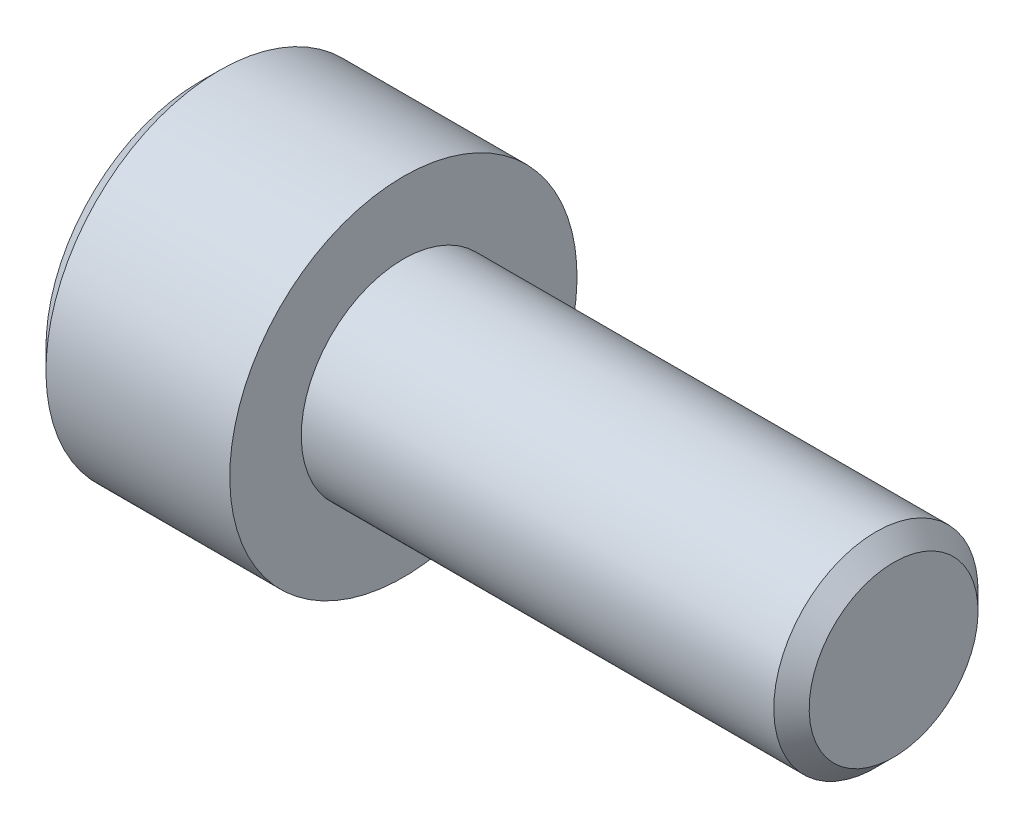
ISO-10303-21;
HEADER;
FILE_DESCRIPTION(('STEP AP214'),'2;1');
FILE_NAME('part.step','',(''),(''),'','','');
FILE_SCHEMA(('AUTOMOTIVE_DESIGN { 1 0 10303 214 1 1 1 1 }'));
ENDSEC;
DATA;
#1=APPLICATION_CONTEXT('core data for automotive mechanical design processes');
#2=APPLICATION_PROTOCOL_DEFINITION('international standard','automotive_design',2000,#1);
#3=PRODUCT_CONTEXT('',#1,'mechanical');
#4=PRODUCT('Part','Part','',(#3));
#5=PRODUCT_RELATED_PRODUCT_CATEGORY('part','',(#4));
#6=PRODUCT_DEFINITION_FORMATION('','',#4);
#7=PRODUCT_DEFINITION_CONTEXT('part definition',#1,'design');
#8=PRODUCT_DEFINITION('design','',#6,#7);
#9=PRODUCT_DEFINITION_SHAPE('','',#8);
#10=(LENGTH_UNIT() NAMED_UNIT(*) SI_UNIT(.MILLI.,.METRE.));
#11=(NAMED_UNIT(*) PLANE_ANGLE_UNIT() SI_UNIT($,.RADIAN.));
#12=(NAMED_UNIT(*) SI_UNIT($,.STERADIAN.) SOLID_ANGLE_UNIT());
#13=UNCERTAINTY_MEASURE_WITH_UNIT(LENGTH_MEASURE(1.E-05),#10,'distance_accuracy_value','');
#14=(GEOMETRIC_REPRESENTATION_CONTEXT(3) GLOBAL_UNCERTAINTY_ASSIGNED_CONTEXT((#13)) GLOBAL_UNIT_ASSIGNED_CONTEXT((#10,
#11,#12)) REPRESENTATION_CONTEXT('',''));
#15=CARTESIAN_POINT('',(0.,0.,0.));
#16=DIRECTION('',(0.,0.,1.));
#17=DIRECTION('',(1.,0.,0.));
#18=AXIS2_PLACEMENT_3D('',#15,#16,#17);
#19=CARTESIAN_POINT('',(12.,0.,0.));
#20=DIRECTION('',(1.,0.,0.));
#21=DIRECTION('',(0.,1.,0.));
#22=AXIS2_PLACEMENT_3D('',#19,#20,#21);
#23=CYLINDRICAL_SURFACE('',#22,2.5);
#24=CARTESIAN_POINT('',(0.,0.,0.));
#25=DIRECTION('',(1.,0.,0.));
#26=DIRECTION('',(0.,1.,0.));
#27=AXIS2_PLACEMENT_3D('',#24,#25,#26);
#28=CIRCLE('',#27,2.5);
#29=CARTESIAN_POINT('',(0.,2.5,0.));
#30=VERTEX_POINT('',#29);
#31=EDGE_CURVE('E142',#30,#30,#28,.T.);
#32=ORIENTED_EDGE('',*,*,#31,.T.);
#33=EDGE_LOOP('',(#32));
#34=FACE_BOUND('',#33,.T.);
#35=CARTESIAN_POINT('',(11.567,0.,0.));
#36=DIRECTION('',(1.,0.,0.));
#37=DIRECTION('',(0.,1.,0.));
#38=AXIS2_PLACEMENT_3D('',#35,#36,#37);
#39=CIRCLE('',#38,2.5);
#40=CARTESIAN_POINT('',(11.567,2.5,0.));
#41=VERTEX_POINT('',#40);
#42=EDGE_CURVE('E11',#41,#41,#39,.T.);
#43=ORIENTED_EDGE('',*,*,#42,.F.);
#44=EDGE_LOOP('',(#43));
#45=FACE_BOUND('',#44,.T.);
#46=ADVANCED_FACE('F37',(#34,#45),#23,.T.);
#47=CARTESIAN_POINT('',(12.,0.,0.));
#48=DIRECTION('',(-1.,0.,0.));
#49=DIRECTION('',(0.,-1.,0.));
#50=AXIS2_PLACEMENT_3D('',#47,#48,#49);
#51=CONICAL_SURFACE('',#50,2.067,0.785398163397449);
#52=ORIENTED_EDGE('',*,*,#42,.T.);
#53=EDGE_LOOP('',(#52));
#54=FACE_BOUND('',#53,.T.);
#55=CARTESIAN_POINT('',(12.,0.,0.));
#56=DIRECTION('',(1.,0.,0.));
#57=DIRECTION('',(0.,1.,0.));
#58=AXIS2_PLACEMENT_3D('',#55,#56,#57);
#59=CIRCLE('',#58,2.067);
#60=CARTESIAN_POINT('',(12.,2.067,0.));
#61=VERTEX_POINT('',#60);
#62=EDGE_CURVE('E50',#61,#61,#59,.T.);
#63=ORIENTED_EDGE('',*,*,#62,.F.);
#64=EDGE_LOOP('',(#63));
#65=FACE_BOUND('',#64,.T.);
#66=ADVANCED_FACE('F162',(#54,#65),#51,.T.);
#67=CARTESIAN_POINT('',(12.,2.067,0.));
#68=DIRECTION('',(1.,0.,0.));
#69=DIRECTION('',(0.,1.,0.));
#70=AXIS2_PLACEMENT_3D('',#67,#68,#69);
#71=PLANE('',#70);
#72=ORIENTED_EDGE('',*,*,#62,.T.);
#73=EDGE_LOOP('',(#72));
#74=FACE_BOUND('',#73,.T.);
#75=ADVANCED_FACE('F159',(#74),#71,.T.);
#76=CARTESIAN_POINT('',(-5.,0.,0.));
#77=DIRECTION('',(-1.,0.,0.));
#78=DIRECTION('',(0.,-1.,0.));
#79=AXIS2_PLACEMENT_3D('',#76,#77,#78);
#80=PLANE('',#79);
#81=DIRECTION('',(0.,0.5,-0.866025403784438));
#82=VECTOR('',#81,1.);
#83=CARTESIAN_POINT('',(-5.,1.15470053837925,2.));
#84=LINE('',#83,#82);
#85=CARTESIAN_POINT('',(-5.,1.15470053837925,2.));
#86=VERTEX_POINT('',#85);
#87=CARTESIAN_POINT('',(-5.,2.3094010767585,0.));
#88=VERTEX_POINT('',#87);
#89=EDGE_CURVE('E53',#86,#88,#84,.T.);
#90=ORIENTED_EDGE('',*,*,#89,.F.);
#91=DIRECTION('',(0.,1.,0.));
#92=VECTOR('',#91,1.);
#93=CARTESIAN_POINT('',(-5.,-1.15470053837925,2.));
#94=LINE('',#93,#92);
#95=CARTESIAN_POINT('',(-5.,-1.15470053837925,2.));
#96=VERTEX_POINT('',#95);
#97=EDGE_CURVE('E140',#96,#86,#94,.T.);
#98=ORIENTED_EDGE('',*,*,#97,.F.);
#99=DIRECTION('',(0.,0.5,0.866025403784439));
#100=VECTOR('',#99,1.);
#101=CARTESIAN_POINT('',(-5.,-2.3094010767585,0.));
#102=LINE('',#101,#100);
#103=CARTESIAN_POINT('',(-5.,-2.3094010767585,0.));
#104=VERTEX_POINT('',#103);
#105=EDGE_CURVE('E134',#104,#96,#102,.T.);
#106=ORIENTED_EDGE('',*,*,#105,.F.);
#107=DIRECTION('',(0.,-0.5,0.866025403784439));
#108=VECTOR('',#107,1.);
#109=CARTESIAN_POINT('',(-5.,-1.15470053837925,-2.));
#110=LINE('',#109,#108);
#111=CARTESIAN_POINT('',(-5.,-1.15470053837925,-2.));
#112=VERTEX_POINT('',#111);
#113=EDGE_CURVE('E105',#112,#104,#110,.T.);
#114=ORIENTED_EDGE('',*,*,#113,.F.);
#115=DIRECTION('',(0.,-1.,0.));
#116=VECTOR('',#115,1.);
#117=CARTESIAN_POINT('',(-5.,1.15470053837925,-2.));
#118=LINE('',#117,#116);
#119=CARTESIAN_POINT('',(-5.,1.15470053837925,-2.));
#120=VERTEX_POINT('',#119);
#121=EDGE_CURVE('E133',#120,#112,#118,.T.);
#122=ORIENTED_EDGE('',*,*,#121,.F.);
#123=DIRECTION('',(0.,-0.5,-0.866025403784439));
#124=VECTOR('',#123,1.);
#125=CARTESIAN_POINT('',(-5.,2.3094010767585,0.));
#126=LINE('',#125,#124);
#127=EDGE_CURVE('E129',#88,#120,#126,.T.);
#128=ORIENTED_EDGE('',*,*,#127,.F.);
#129=EDGE_LOOP('',(#90,#98,#106,#114,#122,#128));
#130=FACE_BOUND('',#129,.T.);
#131=CARTESIAN_POINT('',(-5.,0.,0.));
#132=DIRECTION('',(1.,0.,0.));
#133=DIRECTION('',(0.,1.,0.));
#134=AXIS2_PLACEMENT_3D('',#131,#132,#133);
#135=CIRCLE('',#134,3.75);
#136=CARTESIAN_POINT('',(-5.,3.75,0.));
#137=VERTEX_POINT('',#136);
#138=EDGE_CURVE('E154',#137,#137,#135,.T.);
#139=ORIENTED_EDGE('',*,*,#138,.F.);
#140=EDGE_LOOP('',(#139));
#141=FACE_BOUND('',#140,.T.);
#142=ADVANCED_FACE('F169',(#130,#141),#80,.T.);
#143=CARTESIAN_POINT('',(-4.5,0.,0.));
#144=DIRECTION('',(1.,0.,0.));
#145=DIRECTION('',(0.,1.,0.));
#146=AXIS2_PLACEMENT_3D('',#143,#144,#145);
#147=CONICAL_SURFACE('',#146,4.25,0.785398163397448);
#148=ORIENTED_EDGE('',*,*,#138,.T.);
#149=EDGE_LOOP('',(#148));
#150=FACE_BOUND('',#149,.T.);
#151=CARTESIAN_POINT('',(-4.5,0.,0.));
#152=DIRECTION('',(1.,0.,0.));
#153=DIRECTION('',(0.,1.,0.));
#154=AXIS2_PLACEMENT_3D('',#151,#152,#153);
#155=CIRCLE('',#154,4.25);
#156=CARTESIAN_POINT('',(-4.5,4.25,0.));
#157=VERTEX_POINT('',#156);
#158=EDGE_CURVE('E155',#157,#157,#155,.T.);
#159=ORIENTED_EDGE('',*,*,#158,.F.);
#160=EDGE_LOOP('',(#159));
#161=FACE_BOUND('',#160,.T.);
#162=ADVANCED_FACE('F176',(#150,#161),#147,.T.);
#163=CARTESIAN_POINT('',(12.,0.,0.));
#164=DIRECTION('',(1.,0.,0.));
#165=DIRECTION('',(0.,1.,0.));
#166=AXIS2_PLACEMENT_3D('',#163,#164,#165);
#167=CYLINDRICAL_SURFACE('',#166,4.25);
#168=ORIENTED_EDGE('',*,*,#158,.T.);
#169=EDGE_LOOP('',(#168));
#170=FACE_BOUND('',#169,.T.);
#171=CARTESIAN_POINT('',(0.,0.,0.));
#172=DIRECTION('',(1.,0.,0.));
#173=DIRECTION('',(0.,1.,0.));
#174=AXIS2_PLACEMENT_3D('',#171,#172,#173);
#175=CIRCLE('',#174,4.25);
#176=CARTESIAN_POINT('',(0.,4.25,0.));
#177=VERTEX_POINT('',#176);
#178=EDGE_CURVE('E146',#177,#177,#175,.T.);
#179=ORIENTED_EDGE('',*,*,#178,.F.);
#180=EDGE_LOOP('',(#179));
#181=FACE_BOUND('',#180,.T.);
#182=ADVANCED_FACE('F179',(#170,#181),#167,.T.);
#183=CARTESIAN_POINT('',(0.,2.5,0.));
#184=DIRECTION('',(1.,0.,0.));
#185=DIRECTION('',(0.,1.,0.));
#186=AXIS2_PLACEMENT_3D('',#183,#184,#185);
#187=PLANE('',#186);
#188=ORIENTED_EDGE('',*,*,#178,.T.);
#189=EDGE_LOOP('',(#188));
#190=FACE_BOUND('',#189,.T.);
#191=ORIENTED_EDGE('',*,*,#31,.F.);
#192=EDGE_LOOP('',(#191));
#193=FACE_BOUND('',#192,.T.);
#194=ADVANCED_FACE('F183',(#190,#193),#187,.T.);
#195=CARTESIAN_POINT('',(-2.5,1.15470053837925,2.));
#196=DIRECTION('',(0.,0.866025403784439,0.5));
#197=DIRECTION('',(0.,-0.5,0.866025403784439));
#198=AXIS2_PLACEMENT_3D('',#195,#196,#197);
#199=PLANE('',#198);
#200=ORIENTED_EDGE('',*,*,#89,.T.);
#201=DIRECTION('',(-1.,0.,0.));
#202=VECTOR('',#201,1.);
#203=CARTESIAN_POINT('',(-2.5,2.3094010767585,0.));
#204=LINE('',#203,#202);
#205=CARTESIAN_POINT('',(-2.5,2.3094010767585,0.));
#206=VERTEX_POINT('',#205);
#207=EDGE_CURVE('E81',#206,#88,#204,.T.);
#208=ORIENTED_EDGE('',*,*,#207,.F.);
#209=DIRECTION('',(0.,0.5,-0.866025403784438));
#210=VECTOR('',#209,1.);
#211=CARTESIAN_POINT('',(-2.5,1.15470053837925,2.));
#212=LINE('',#211,#210);
#213=CARTESIAN_POINT('',(-2.5,1.15470053837925,2.));
#214=VERTEX_POINT('',#213);
#215=EDGE_CURVE('E136',#214,#206,#212,.T.);
#216=ORIENTED_EDGE('',*,*,#215,.F.);
#217=DIRECTION('',(-1.,0.,0.));
#218=VECTOR('',#217,1.);
#219=CARTESIAN_POINT('',(-2.5,1.15470053837925,2.));
#220=LINE('',#219,#218);
#221=EDGE_CURVE('E65',#214,#86,#220,.T.);
#222=ORIENTED_EDGE('',*,*,#221,.T.);
#223=EDGE_LOOP('',(#200,#208,#216,#222));
#224=FACE_BOUND('',#223,.T.);
#225=ADVANCED_FACE('F189',(#224),#199,.F.);
#226=CARTESIAN_POINT('',(-2.5,-1.15470053837925,2.));
#227=DIRECTION('',(0.,0.,1.));
#228=DIRECTION('',(0.,-1.,0.));
#229=AXIS2_PLACEMENT_3D('',#226,#227,#228);
#230=PLANE('',#229);
#231=ORIENTED_EDGE('',*,*,#97,.T.);
#232=ORIENTED_EDGE('',*,*,#221,.F.);
#233=DIRECTION('',(0.,1.,0.));
#234=VECTOR('',#233,1.);
#235=CARTESIAN_POINT('',(-2.5,-1.15470053837925,2.));
#236=LINE('',#235,#234);
#237=CARTESIAN_POINT('',(-2.5,-1.15470053837925,2.));
#238=VERTEX_POINT('',#237);
#239=EDGE_CURVE('E112',#238,#214,#236,.T.);
#240=ORIENTED_EDGE('',*,*,#239,.F.);
#241=DIRECTION('',(-1.,0.,0.));
#242=VECTOR('',#241,1.);
#243=CARTESIAN_POINT('',(-2.5,-1.15470053837925,2.));
#244=LINE('',#243,#242);
#245=EDGE_CURVE('E106',#238,#96,#244,.T.);
#246=ORIENTED_EDGE('',*,*,#245,.T.);
#247=EDGE_LOOP('',(#231,#232,#240,#246));
#248=FACE_BOUND('',#247,.T.);
#249=ADVANCED_FACE('F195',(#248),#230,.F.);
#250=CARTESIAN_POINT('',(-2.5,-2.3094010767585,0.));
#251=DIRECTION('',(0.,-0.866025403784439,0.5));
#252=DIRECTION('',(0.,-0.5,-0.866025403784439));
#253=AXIS2_PLACEMENT_3D('',#250,#251,#252);
#254=PLANE('',#253);
#255=ORIENTED_EDGE('',*,*,#105,.T.);
#256=ORIENTED_EDGE('',*,*,#245,.F.);
#257=DIRECTION('',(0.,0.5,0.866025403784439));
#258=VECTOR('',#257,1.);
#259=CARTESIAN_POINT('',(-2.5,-2.3094010767585,0.));
#260=LINE('',#259,#258);
#261=CARTESIAN_POINT('',(-2.5,-2.3094010767585,0.));
#262=VERTEX_POINT('',#261);
#263=EDGE_CURVE('E109',#262,#238,#260,.T.);
#264=ORIENTED_EDGE('',*,*,#263,.F.);
#265=DIRECTION('',(-1.,0.,0.));
#266=VECTOR('',#265,1.);
#267=CARTESIAN_POINT('',(-2.5,-2.3094010767585,0.));
#268=LINE('',#267,#266);
#269=EDGE_CURVE('E94',#262,#104,#268,.T.);
#270=ORIENTED_EDGE('',*,*,#269,.T.);
#271=EDGE_LOOP('',(#255,#256,#264,#270));
#272=FACE_BOUND('',#271,.T.);
#273=ADVANCED_FACE('F111',(#272),#254,.F.);
#274=CARTESIAN_POINT('',(-2.5,-1.15470053837925,-2.));
#275=DIRECTION('',(0.,-0.866025403784439,-0.5));
#276=DIRECTION('',(0.,0.5,-0.866025403784439));
#277=AXIS2_PLACEMENT_3D('',#274,#275,#276);
#278=PLANE('',#277);
#279=ORIENTED_EDGE('',*,*,#113,.T.);
#280=ORIENTED_EDGE('',*,*,#269,.F.);
#281=DIRECTION('',(0.,-0.5,0.866025403784439));
#282=VECTOR('',#281,1.);
#283=CARTESIAN_POINT('',(-2.5,-1.15470053837925,-2.));
#284=LINE('',#283,#282);
#285=CARTESIAN_POINT('',(-2.5,-1.15470053837925,-2.));
#286=VERTEX_POINT('',#285);
#287=EDGE_CURVE('E100',#286,#262,#284,.T.);
#288=ORIENTED_EDGE('',*,*,#287,.F.);
#289=DIRECTION('',(-1.,0.,0.));
#290=VECTOR('',#289,1.);
#291=CARTESIAN_POINT('',(-2.5,-1.15470053837925,-2.));
#292=LINE('',#291,#290);
#293=EDGE_CURVE('E110',#286,#112,#292,.T.);
#294=ORIENTED_EDGE('',*,*,#293,.T.);
#295=EDGE_LOOP('',(#279,#280,#288,#294));
#296=FACE_BOUND('',#295,.T.);
#297=ADVANCED_FACE('F97',(#296),#278,.F.);
#298=CARTESIAN_POINT('',(-2.5,1.15470053837925,-2.));
#299=DIRECTION('',(0.,0.,-1.));
#300=DIRECTION('',(-1.,0.,0.));
#301=AXIS2_PLACEMENT_3D('',#298,#299,#300);
#302=PLANE('',#301);
#303=ORIENTED_EDGE('',*,*,#121,.T.);
#304=ORIENTED_EDGE('',*,*,#293,.F.);
#305=DIRECTION('',(0.,-1.,0.));
#306=VECTOR('',#305,1.);
#307=CARTESIAN_POINT('',(-2.5,1.15470053837925,-2.));
#308=LINE('',#307,#306);
#309=CARTESIAN_POINT('',(-2.5,1.15470053837925,-2.));
#310=VERTEX_POINT('',#309);
#311=EDGE_CURVE('E119',#310,#286,#308,.T.);
#312=ORIENTED_EDGE('',*,*,#311,.F.);
#313=DIRECTION('',(-1.,0.,0.));
#314=VECTOR('',#313,1.);
#315=CARTESIAN_POINT('',(-2.5,1.15470053837925,-2.));
#316=LINE('',#315,#314);
#317=EDGE_CURVE('E144',#310,#120,#316,.T.);
#318=ORIENTED_EDGE('',*,*,#317,.T.);
#319=EDGE_LOOP('',(#303,#304,#312,#318));
#320=FACE_BOUND('',#319,.T.);
#321=ADVANCED_FACE('F198',(#320),#302,.F.);
#322=CARTESIAN_POINT('',(-2.5,2.3094010767585,0.));
#323=DIRECTION('',(0.,0.866025403784439,-0.5));
#324=DIRECTION('',(0.,0.5,0.866025403784439));
#325=AXIS2_PLACEMENT_3D('',#322,#323,#324);
#326=PLANE('',#325);
#327=ORIENTED_EDGE('',*,*,#127,.T.);
#328=ORIENTED_EDGE('',*,*,#317,.F.);
#329=DIRECTION('',(0.,-0.5,-0.866025403784439));
#330=VECTOR('',#329,1.);
#331=CARTESIAN_POINT('',(-2.5,2.3094010767585,0.));
#332=LINE('',#331,#330);
#333=EDGE_CURVE('E125',#206,#310,#332,.T.);
#334=ORIENTED_EDGE('',*,*,#333,.F.);
#335=ORIENTED_EDGE('',*,*,#207,.T.);
#336=EDGE_LOOP('',(#327,#328,#334,#335));
#337=FACE_BOUND('',#336,.T.);
#338=ADVANCED_FACE('F194',(#337),#326,.F.);
#339=CARTESIAN_POINT('',(-2.5,0.,0.));
#340=DIRECTION('',(-1.,0.,0.));
#341=DIRECTION('',(0.,0.,1.));
#342=AXIS2_PLACEMENT_3D('',#339,#340,#341);
#343=PLANE('',#342);
#344=ORIENTED_EDGE('',*,*,#215,.T.);
#345=ORIENTED_EDGE('',*,*,#333,.T.);
#346=ORIENTED_EDGE('',*,*,#311,.T.);
#347=ORIENTED_EDGE('',*,*,#287,.T.);
#348=ORIENTED_EDGE('',*,*,#263,.T.);
#349=ORIENTED_EDGE('',*,*,#239,.T.);
#350=EDGE_LOOP('',(#344,#345,#346,#347,#348,#349));
#351=FACE_BOUND('',#350,.T.);
#352=ADVANCED_FACE('F120',(#351),#343,.T.);
#353=CLOSED_SHELL('',(#46,#66,#75,#142,#162,#182,#194,#225,#249,#273,#297,#321,#338,#352));
#354=MANIFOLD_SOLID_BREP('B2',#353);
#355=ADVANCED_BREP_SHAPE_REPRESENTATION('',(#18,#354),#14);
#356=SHAPE_DEFINITION_REPRESENTATION(#9,#355);
ENDSEC;
END-ISO-10303-21;
